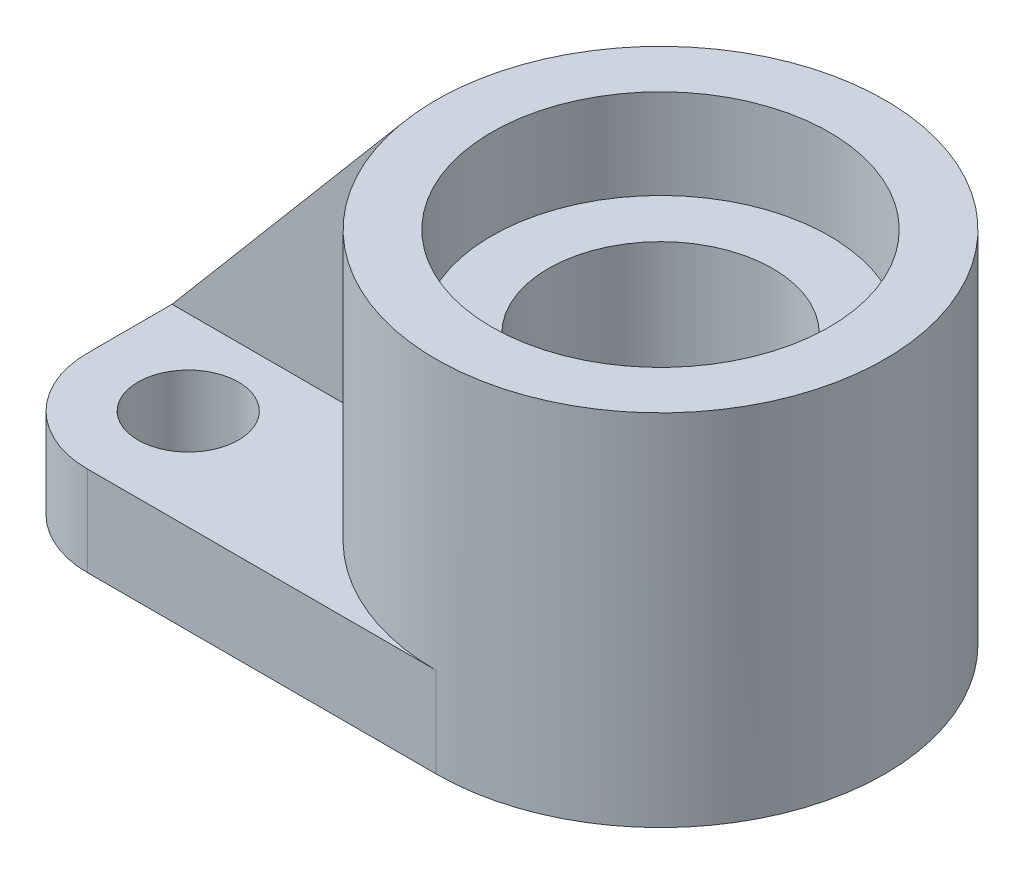
ISO-10303-21;
HEADER;
FILE_DESCRIPTION(('STEP AP214'),'2;1');
FILE_NAME('part.step','',(''),(''),'','','');
FILE_SCHEMA(('AUTOMOTIVE_DESIGN { 1 0 10303 214 1 1 1 1 }'));
ENDSEC;
DATA;
#1=APPLICATION_CONTEXT('core data for automotive mechanical design processes');
#2=APPLICATION_PROTOCOL_DEFINITION('international standard','automotive_design',2000,#1);
#3=PRODUCT_CONTEXT('',#1,'mechanical');
#4=PRODUCT('Part','Part','',(#3));
#5=PRODUCT_RELATED_PRODUCT_CATEGORY('part','',(#4));
#6=PRODUCT_DEFINITION_FORMATION('','',#4);
#7=PRODUCT_DEFINITION_CONTEXT('part definition',#1,'design');
#8=PRODUCT_DEFINITION('design','',#6,#7);
#9=PRODUCT_DEFINITION_SHAPE('','',#8);
#10=(LENGTH_UNIT() NAMED_UNIT(*) SI_UNIT(.MILLI.,.METRE.));
#11=(NAMED_UNIT(*) PLANE_ANGLE_UNIT() SI_UNIT($,.RADIAN.));
#12=(NAMED_UNIT(*) SI_UNIT($,.STERADIAN.) SOLID_ANGLE_UNIT());
#13=UNCERTAINTY_MEASURE_WITH_UNIT(LENGTH_MEASURE(1.E-05),#10,'distance_accuracy_value','');
#14=(GEOMETRIC_REPRESENTATION_CONTEXT(3) GLOBAL_UNCERTAINTY_ASSIGNED_CONTEXT((#13)) GLOBAL_UNIT_ASSIGNED_CONTEXT((#10,
#11,#12)) REPRESENTATION_CONTEXT('',''));
#15=CARTESIAN_POINT('',(0.,0.,0.));
#16=DIRECTION('',(0.,0.,1.));
#17=DIRECTION('',(1.,0.,0.));
#18=AXIS2_PLACEMENT_3D('',#15,#16,#17);
#19=CARTESIAN_POINT('',(0.,50.,0.));
#20=DIRECTION('',(0.,1.,0.));
#21=DIRECTION('',(0.,0.,1.));
#22=AXIS2_PLACEMENT_3D('',#19,#20,#21);
#23=PLANE('',#22);
#24=CARTESIAN_POINT('',(-68.9999999999999,50.,-69.));
#25=DIRECTION('',(0.,1.,0.));
#26=DIRECTION('',(0.,0.,1.));
#27=AXIS2_PLACEMENT_3D('',#24,#25,#26);
#28=CIRCLE('',#27,28.);
#29=CARTESIAN_POINT('',(-68.9999999999999,50.,-41.));
#30=VERTEX_POINT('',#29);
#31=EDGE_CURVE('E200',#30,#30,#28,.T.);
#32=ORIENTED_EDGE('',*,*,#31,.F.);
#33=EDGE_LOOP('',(#32));
#34=FACE_BOUND('',#33,.T.);
#35=DIRECTION('',(0.,0.,-1.));
#36=VECTOR('',#35,1.);
#37=CARTESIAN_POINT('',(-125.,50.,0.));
#38=LINE('',#37,#36);
#39=CARTESIAN_POINT('',(-125.,50.,-22.));
#40=VERTEX_POINT('',#39);
#41=CARTESIAN_POINT('',(-125.,50.,-68.9999999999996));
#42=VERTEX_POINT('',#41);
#43=EDGE_CURVE('E78',#40,#42,#38,.T.);
#44=ORIENTED_EDGE('',*,*,#43,.F.);
#45=DIRECTION('',(-1.,0.,0.));
#46=VECTOR('',#45,1.);
#47=CARTESIAN_POINT('',(-125.,50.,-22.));
#48=LINE('',#47,#46);
#49=CARTESIAN_POINT('',(1.95122918127144,50.,-22.));
#50=VERTEX_POINT('',#49);
#51=EDGE_CURVE('E148',#50,#40,#48,.T.);
#52=ORIENTED_EDGE('',*,*,#51,.F.);
#53=CARTESIAN_POINT('',(125.,50.,0.));
#54=DIRECTION('',(0.,1.,0.));
#55=DIRECTION('',(0.,0.,1.));
#56=AXIS2_PLACEMENT_3D('',#53,#54,#55);
#57=CIRCLE('',#56,125.);
#58=CARTESIAN_POINT('',(125.,50.,-125.));
#59=VERTEX_POINT('',#58);
#60=EDGE_CURVE('E135',#59,#50,#57,.T.);
#61=ORIENTED_EDGE('',*,*,#60,.F.);
#62=DIRECTION('',(1.,0.,0.));
#63=VECTOR('',#62,1.);
#64=CARTESIAN_POINT('',(0.,50.,-125.));
#65=LINE('',#64,#63);
#66=CARTESIAN_POINT('',(-68.9999999999995,50.,-125.));
#67=VERTEX_POINT('',#66);
#68=EDGE_CURVE('E205',#67,#59,#65,.T.);
#69=ORIENTED_EDGE('',*,*,#68,.F.);
#70=CARTESIAN_POINT('',(-68.9999999999999,50.,-69.));
#71=DIRECTION('',(0.,1.,0.));
#72=DIRECTION('',(0.,0.,1.));
#73=AXIS2_PLACEMENT_3D('',#70,#71,#72);
#74=CIRCLE('',#73,56.);
#75=EDGE_CURVE('E208',#67,#42,#74,.T.);
#76=ORIENTED_EDGE('',*,*,#75,.T.);
#77=EDGE_LOOP('',(#44,#52,#61,#69,#76));
#78=FACE_BOUND('',#77,.T.);
#79=ADVANCED_FACE('F60',(#34,#78),#23,.T.);
#80=CARTESIAN_POINT('',(-68.9999999999999,50.,69.0000000000001));
#81=DIRECTION('',(0.,1.,0.));
#82=DIRECTION('',(0.,0.,1.));
#83=AXIS2_PLACEMENT_3D('',#80,#81,#82);
#84=CIRCLE('',#83,28.);
#85=CARTESIAN_POINT('',(-68.9999999999999,50.,97.0000000000001));
#86=VERTEX_POINT('',#85);
#87=EDGE_CURVE('E196',#86,#86,#84,.T.);
#88=ORIENTED_EDGE('',*,*,#87,.F.);
#89=EDGE_LOOP('',(#88));
#90=FACE_BOUND('',#89,.T.);
#91=CARTESIAN_POINT('',(1.95122918127141,50.,22.));
#92=VERTEX_POINT('',#91);
#93=CARTESIAN_POINT('',(125.,50.,125.));
#94=VERTEX_POINT('',#93);
#95=EDGE_CURVE('E145',#92,#94,#57,.T.);
#96=ORIENTED_EDGE('',*,*,#95,.F.);
#97=DIRECTION('',(1.,0.,0.));
#98=VECTOR('',#97,1.);
#99=CARTESIAN_POINT('',(-125.,50.,22.));
#100=LINE('',#99,#98);
#101=CARTESIAN_POINT('',(-125.,50.,22.));
#102=VERTEX_POINT('',#101);
#103=EDGE_CURVE('E86',#102,#92,#100,.T.);
#104=ORIENTED_EDGE('',*,*,#103,.F.);
#105=CARTESIAN_POINT('',(-125.,50.,68.9999999999997));
#106=VERTEX_POINT('',#105);
#107=EDGE_CURVE('E219',#106,#102,#38,.T.);
#108=ORIENTED_EDGE('',*,*,#107,.F.);
#109=CARTESIAN_POINT('',(-68.9999999999999,50.,69.0000000000001));
#110=DIRECTION('',(0.,1.,0.));
#111=DIRECTION('',(0.,0.,1.));
#112=AXIS2_PLACEMENT_3D('',#109,#110,#111);
#113=CIRCLE('',#112,56.);
#114=CARTESIAN_POINT('',(-68.9999999999995,50.,125.));
#115=VERTEX_POINT('',#114);
#116=EDGE_CURVE('E213',#115,#106,#113,.F.);
#117=ORIENTED_EDGE('',*,*,#116,.F.);
#118=DIRECTION('',(1.,0.,0.));
#119=VECTOR('',#118,1.);
#120=CARTESIAN_POINT('',(0.,50.,125.));
#121=LINE('',#120,#119);
#122=EDGE_CURVE('E224',#115,#94,#121,.T.);
#123=ORIENTED_EDGE('',*,*,#122,.T.);
#124=EDGE_LOOP('',(#96,#104,#108,#117,#123));
#125=FACE_BOUND('',#124,.T.);
#126=ADVANCED_FACE('F293',(#90,#125),#23,.T.);
#127=CARTESIAN_POINT('',(125.,200.,0.));
#128=DIRECTION('',(0.,-1.,0.));
#129=DIRECTION('',(0.,0.,-1.));
#130=AXIS2_PLACEMENT_3D('',#127,#128,#129);
#131=CYLINDRICAL_SURFACE('',#130,125.);
#132=DIRECTION('',(0.,-1.,0.));
#133=VECTOR('',#132,1.);
#134=CARTESIAN_POINT('',(1.95122918127144,200.,22.));
#135=LINE('',#134,#133);
#136=CARTESIAN_POINT('',(1.9511408744372,200.,22.0000000257564));
#137=VERTEX_POINT('',#136);
#138=EDGE_CURVE('E157',#92,#137,#135,.F.);
#139=ORIENTED_EDGE('',*,*,#138,.F.);
#140=ORIENTED_EDGE('',*,*,#95,.T.);
#141=DIRECTION('',(0.,-1.,0.));
#142=VECTOR('',#141,1.);
#143=CARTESIAN_POINT('',(125.,50.,125.));
#144=LINE('',#143,#142);
#145=CARTESIAN_POINT('',(125.,0.,125.));
#146=VERTEX_POINT('',#145);
#147=EDGE_CURVE('E259',#94,#146,#144,.T.);
#148=ORIENTED_EDGE('',*,*,#147,.T.);
#149=CARTESIAN_POINT('',(125.,0.,0.));
#150=DIRECTION('',(0.,1.,0.));
#151=DIRECTION('',(0.,0.,1.));
#152=AXIS2_PLACEMENT_3D('',#149,#150,#151);
#153=CIRCLE('',#152,125.);
#154=CARTESIAN_POINT('',(125.,0.,-125.));
#155=VERTEX_POINT('',#154);
#156=EDGE_CURVE('E192',#146,#155,#153,.T.);
#157=ORIENTED_EDGE('',*,*,#156,.T.);
#158=DIRECTION('',(0.,-1.,0.));
#159=VECTOR('',#158,1.);
#160=CARTESIAN_POINT('',(125.,50.,-125.));
#161=LINE('',#160,#159);
#162=EDGE_CURVE('E141',#59,#155,#161,.T.);
#163=ORIENTED_EDGE('',*,*,#162,.F.);
#164=ORIENTED_EDGE('',*,*,#60,.T.);
#165=DIRECTION('',(0.,-1.,0.));
#166=VECTOR('',#165,1.);
#167=CARTESIAN_POINT('',(1.95122918127144,200.,-22.));
#168=LINE('',#167,#166);
#169=CARTESIAN_POINT('',(1.95113013931138,200.,-22.0000000251392));
#170=VERTEX_POINT('',#169);
#171=EDGE_CURVE('E138',#170,#50,#168,.T.);
#172=ORIENTED_EDGE('',*,*,#171,.F.);
#173=CARTESIAN_POINT('',(125.,200.,0.));
#174=DIRECTION('',(0.,-1.,0.));
#175=DIRECTION('',(0.,0.,-1.));
#176=AXIS2_PLACEMENT_3D('',#173,#174,#175);
#177=CIRCLE('',#176,125.);
#178=EDGE_CURVE('E195',#137,#170,#177,.F.);
#179=ORIENTED_EDGE('',*,*,#178,.F.);
#180=EDGE_LOOP('',(#139,#140,#148,#157,#163,#164,#172,#179));
#181=FACE_BOUND('',#180,.T.);
#182=ADVANCED_FACE('F136',(#181),#131,.T.);
#183=CARTESIAN_POINT('',(0.,50.,-125.));
#184=DIRECTION('',(0.,0.,-1.));
#185=DIRECTION('',(-1.,0.,0.));
#186=AXIS2_PLACEMENT_3D('',#183,#184,#185);
#187=PLANE('',#186);
#188=DIRECTION('',(1.,0.,0.));
#189=VECTOR('',#188,1.);
#190=CARTESIAN_POINT('',(0.,0.,-125.));
#191=LINE('',#190,#189);
#192=CARTESIAN_POINT('',(-68.9999999999995,0.,-125.));
#193=VERTEX_POINT('',#192);
#194=EDGE_CURVE('E238',#193,#155,#191,.T.);
#195=ORIENTED_EDGE('',*,*,#194,.F.);
#196=DIRECTION('',(0.,-1.,0.));
#197=VECTOR('',#196,1.);
#198=CARTESIAN_POINT('',(-68.9999999999995,50.,-125.));
#199=LINE('',#198,#197);
#200=EDGE_CURVE('E12',#67,#193,#199,.T.);
#201=ORIENTED_EDGE('',*,*,#200,.F.);
#202=ORIENTED_EDGE('',*,*,#68,.T.);
#203=ORIENTED_EDGE('',*,*,#162,.T.);
#204=EDGE_LOOP('',(#195,#201,#202,#203));
#205=FACE_BOUND('',#204,.T.);
#206=ADVANCED_FACE('F292',(#205),#187,.T.);
#207=CARTESIAN_POINT('',(-68.9999999999999,50.,-69.));
#208=DIRECTION('',(0.,-1.,0.));
#209=DIRECTION('',(0.,0.,-1.));
#210=AXIS2_PLACEMENT_3D('',#207,#208,#209);
#211=CYLINDRICAL_SURFACE('',#210,56.);
#212=CARTESIAN_POINT('',(-68.9999999999999,0.,-69.));
#213=DIRECTION('',(0.,1.,0.));
#214=DIRECTION('',(0.,0.,1.));
#215=AXIS2_PLACEMENT_3D('',#212,#213,#214);
#216=CIRCLE('',#215,56.);
#217=CARTESIAN_POINT('',(-125.,0.,-68.9999999999996));
#218=VERTEX_POINT('',#217);
#219=EDGE_CURVE('E242',#193,#218,#216,.T.);
#220=ORIENTED_EDGE('',*,*,#219,.T.);
#221=DIRECTION('',(0.,-1.,0.));
#222=VECTOR('',#221,1.);
#223=CARTESIAN_POINT('',(-125.,50.,-68.9999999999996));
#224=LINE('',#223,#222);
#225=EDGE_CURVE('E70',#42,#218,#224,.T.);
#226=ORIENTED_EDGE('',*,*,#225,.F.);
#227=ORIENTED_EDGE('',*,*,#75,.F.);
#228=ORIENTED_EDGE('',*,*,#200,.T.);
#229=EDGE_LOOP('',(#220,#226,#227,#228));
#230=FACE_BOUND('',#229,.T.);
#231=ADVANCED_FACE('F312',(#230),#211,.T.);
#232=CARTESIAN_POINT('',(-125.,50.,0.));
#233=DIRECTION('',(-1.,0.,0.));
#234=DIRECTION('',(0.,0.,1.));
#235=AXIS2_PLACEMENT_3D('',#232,#233,#234);
#236=PLANE('',#235);
#237=DIRECTION('',(0.,0.,-1.));
#238=VECTOR('',#237,1.);
#239=CARTESIAN_POINT('',(-125.,0.,0.));
#240=LINE('',#239,#238);
#241=CARTESIAN_POINT('',(-125.,0.,68.9999999999997));
#242=VERTEX_POINT('',#241);
#243=EDGE_CURVE('E246',#242,#218,#240,.T.);
#244=ORIENTED_EDGE('',*,*,#243,.F.);
#245=DIRECTION('',(0.,-1.,0.));
#246=VECTOR('',#245,1.);
#247=CARTESIAN_POINT('',(-125.,50.,68.9999999999997));
#248=LINE('',#247,#246);
#249=EDGE_CURVE('E266',#106,#242,#248,.T.);
#250=ORIENTED_EDGE('',*,*,#249,.F.);
#251=ORIENTED_EDGE('',*,*,#107,.T.);
#252=DIRECTION('',(0.,0.,1.));
#253=VECTOR('',#252,1.);
#254=CARTESIAN_POINT('',(-125.,50.,-22.));
#255=LINE('',#254,#253);
#256=EDGE_CURVE('E337',#40,#102,#255,.T.);
#257=ORIENTED_EDGE('',*,*,#256,.F.);
#258=ORIENTED_EDGE('',*,*,#43,.T.);
#259=ORIENTED_EDGE('',*,*,#225,.T.);
#260=EDGE_LOOP('',(#244,#250,#251,#257,#258,#259));
#261=FACE_BOUND('',#260,.T.);
#262=ADVANCED_FACE('F308',(#261),#236,.T.);
#263=CARTESIAN_POINT('',(-68.9999999999999,50.,69.0000000000001));
#264=DIRECTION('',(0.,-1.,0.));
#265=DIRECTION('',(0.,0.,-1.));
#266=AXIS2_PLACEMENT_3D('',#263,#264,#265);
#267=CYLINDRICAL_SURFACE('',#266,56.);
#268=CARTESIAN_POINT('',(-68.9999999999999,0.,69.0000000000001));
#269=DIRECTION('',(0.,1.,0.));
#270=DIRECTION('',(0.,0.,1.));
#271=AXIS2_PLACEMENT_3D('',#268,#269,#270);
#272=CIRCLE('',#271,56.);
#273=CARTESIAN_POINT('',(-68.9999999999995,0.,125.));
#274=VERTEX_POINT('',#273);
#275=EDGE_CURVE('E250',#274,#242,#272,.F.);
#276=ORIENTED_EDGE('',*,*,#275,.F.);
#277=DIRECTION('',(0.,-1.,0.));
#278=VECTOR('',#277,1.);
#279=CARTESIAN_POINT('',(-68.9999999999995,50.,125.));
#280=LINE('',#279,#278);
#281=EDGE_CURVE('E263',#115,#274,#280,.T.);
#282=ORIENTED_EDGE('',*,*,#281,.F.);
#283=ORIENTED_EDGE('',*,*,#116,.T.);
#284=ORIENTED_EDGE('',*,*,#249,.T.);
#285=EDGE_LOOP('',(#276,#282,#283,#284));
#286=FACE_BOUND('',#285,.T.);
#287=ADVANCED_FACE('F304',(#286),#267,.T.);
#288=CARTESIAN_POINT('',(0.,50.,125.));
#289=DIRECTION('',(0.,0.,-1.));
#290=DIRECTION('',(-1.,0.,0.));
#291=AXIS2_PLACEMENT_3D('',#288,#289,#290);
#292=PLANE('',#291);
#293=DIRECTION('',(1.,0.,0.));
#294=VECTOR('',#293,1.);
#295=CARTESIAN_POINT('',(0.,0.,125.));
#296=LINE('',#295,#294);
#297=EDGE_CURVE('E201',#274,#146,#296,.T.);
#298=ORIENTED_EDGE('',*,*,#297,.T.);
#299=ORIENTED_EDGE('',*,*,#147,.F.);
#300=ORIENTED_EDGE('',*,*,#122,.F.);
#301=ORIENTED_EDGE('',*,*,#281,.T.);
#302=EDGE_LOOP('',(#298,#299,#300,#301));
#303=FACE_BOUND('',#302,.T.);
#304=ADVANCED_FACE('F300',(#303),#292,.F.);
#305=CARTESIAN_POINT('',(-68.9999999999999,50.,-69.));
#306=DIRECTION('',(0.,-1.,0.));
#307=DIRECTION('',(0.,0.,-1.));
#308=AXIS2_PLACEMENT_3D('',#305,#306,#307);
#309=CYLINDRICAL_SURFACE('',#308,28.);
#310=ORIENTED_EDGE('',*,*,#31,.T.);
#311=EDGE_LOOP('',(#310));
#312=FACE_BOUND('',#311,.T.);
#313=CARTESIAN_POINT('',(-68.9999999999999,0.,-69.));
#314=DIRECTION('',(0.,1.,0.));
#315=DIRECTION('',(0.,0.,1.));
#316=AXIS2_PLACEMENT_3D('',#313,#314,#315);
#317=CIRCLE('',#316,28.);
#318=CARTESIAN_POINT('',(-68.9999999999999,0.,-41.));
#319=VERTEX_POINT('',#318);
#320=EDGE_CURVE('E233',#319,#319,#317,.T.);
#321=ORIENTED_EDGE('',*,*,#320,.F.);
#322=EDGE_LOOP('',(#321));
#323=FACE_BOUND('',#322,.T.);
#324=ADVANCED_FACE('F303',(#312,#323),#309,.F.);
#325=CARTESIAN_POINT('',(-68.9999999999999,50.,69.0000000000001));
#326=DIRECTION('',(0.,-1.,0.));
#327=DIRECTION('',(0.,0.,-1.));
#328=AXIS2_PLACEMENT_3D('',#325,#326,#327);
#329=CYLINDRICAL_SURFACE('',#328,28.);
#330=ORIENTED_EDGE('',*,*,#87,.T.);
#331=EDGE_LOOP('',(#330));
#332=FACE_BOUND('',#331,.T.);
#333=CARTESIAN_POINT('',(-68.9999999999999,0.,69.0000000000001));
#334=DIRECTION('',(0.,1.,0.));
#335=DIRECTION('',(0.,0.,1.));
#336=AXIS2_PLACEMENT_3D('',#333,#334,#335);
#337=CIRCLE('',#336,28.);
#338=CARTESIAN_POINT('',(-68.9999999999999,0.,97.0000000000001));
#339=VERTEX_POINT('',#338);
#340=EDGE_CURVE('E228',#339,#339,#337,.T.);
#341=ORIENTED_EDGE('',*,*,#340,.F.);
#342=EDGE_LOOP('',(#341));
#343=FACE_BOUND('',#342,.T.);
#344=ADVANCED_FACE('F62',(#332,#343),#329,.F.);
#345=CARTESIAN_POINT('',(0.,0.,0.));
#346=DIRECTION('',(0.,1.,0.));
#347=DIRECTION('',(0.,0.,1.));
#348=AXIS2_PLACEMENT_3D('',#345,#346,#347);
#349=PLANE('',#348);
#350=CARTESIAN_POINT('',(125.,0.,0.));
#351=DIRECTION('',(0.,1.,0.));
#352=DIRECTION('',(0.,0.,1.));
#353=AXIS2_PLACEMENT_3D('',#350,#351,#352);
#354=CIRCLE('',#353,62.4999999999999);
#355=CARTESIAN_POINT('',(125.,0.,62.4999999999999));
#356=VERTEX_POINT('',#355);
#357=EDGE_CURVE('E188',#356,#356,#354,.T.);
#358=ORIENTED_EDGE('',*,*,#357,.T.);
#359=EDGE_LOOP('',(#358));
#360=FACE_BOUND('',#359,.T.);
#361=ORIENTED_EDGE('',*,*,#340,.T.);
#362=EDGE_LOOP('',(#361));
#363=FACE_BOUND('',#362,.T.);
#364=ORIENTED_EDGE('',*,*,#320,.T.);
#365=EDGE_LOOP('',(#364));
#366=FACE_BOUND('',#365,.T.);
#367=ORIENTED_EDGE('',*,*,#194,.T.);
#368=ORIENTED_EDGE('',*,*,#156,.F.);
#369=ORIENTED_EDGE('',*,*,#297,.F.);
#370=ORIENTED_EDGE('',*,*,#275,.T.);
#371=ORIENTED_EDGE('',*,*,#243,.T.);
#372=ORIENTED_EDGE('',*,*,#219,.F.);
#373=EDGE_LOOP('',(#367,#368,#369,#370,#371,#372));
#374=FACE_BOUND('',#373,.T.);
#375=ADVANCED_FACE('F288',(#360,#363,#366,#374),#349,.F.);
#376=CARTESIAN_POINT('',(125.,200.,0.));
#377=DIRECTION('',(0.,1.,0.));
#378=DIRECTION('',(0.,0.,1.));
#379=AXIS2_PLACEMENT_3D('',#376,#377,#378);
#380=PLANE('',#379);
#381=ORIENTED_EDGE('',*,*,#178,.T.);
#382=CARTESIAN_POINT('',(1.95122918127132,200.,22.));
#383=CARTESIAN_POINT('',(0.660562514604653,200.,14.7811387786346));
#384=CARTESIAN_POINT('',(0.,200.,7.39101962602793));
#385=CARTESIAN_POINT('',(0.,200.,-7.39101962602797));
#386=CARTESIAN_POINT('',(0.660562514604664,200.,-14.7811387786346));
#387=CARTESIAN_POINT('',(1.95122918127133,200.,-22.));
#388=B_SPLINE_CURVE_WITH_KNOTS('',3,(#382,#383,#384,#385,#386,#387),.UNSPECIFIED.,.F.,.F.,(4,2,
4),(0.,0.5,1.),.UNSPECIFIED.);
#389=EDGE_CURVE('E234',#170,#137,#388,.F.);
#390=ORIENTED_EDGE('',*,*,#389,.T.);
#391=EDGE_LOOP('',(#381,#390));
#392=FACE_BOUND('',#391,.T.);
#393=CARTESIAN_POINT('',(125.,200.,0.));
#394=DIRECTION('',(0.,1.,0.));
#395=DIRECTION('',(0.,0.,1.));
#396=AXIS2_PLACEMENT_3D('',#393,#394,#395);
#397=CIRCLE('',#396,94.);
#398=CARTESIAN_POINT('',(125.,200.,94.));
#399=VERTEX_POINT('',#398);
#400=EDGE_CURVE('E163',#399,#399,#397,.T.);
#401=ORIENTED_EDGE('',*,*,#400,.F.);
#402=EDGE_LOOP('',(#401));
#403=FACE_BOUND('',#402,.T.);
#404=ADVANCED_FACE('F277',(#392,#403),#380,.T.);
#405=CARTESIAN_POINT('',(125.,200.,0.));
#406=DIRECTION('',(0.,1.,0.));
#407=DIRECTION('',(0.,0.,1.));
#408=AXIS2_PLACEMENT_3D('',#405,#406,#407);
#409=CYLINDRICAL_SURFACE('',#408,62.5);
#410=ORIENTED_EDGE('',*,*,#357,.F.);
#411=EDGE_LOOP('',(#410));
#412=FACE_BOUND('',#411,.T.);
#413=CARTESIAN_POINT('',(125.,150.,0.));
#414=DIRECTION('',(0.,1.,0.));
#415=DIRECTION('',(0.,0.,1.));
#416=AXIS2_PLACEMENT_3D('',#413,#414,#415);
#417=CIRCLE('',#416,62.5);
#418=CARTESIAN_POINT('',(125.,150.,62.5));
#419=VERTEX_POINT('',#418);
#420=EDGE_CURVE('E184',#419,#419,#417,.T.);
#421=ORIENTED_EDGE('',*,*,#420,.T.);
#422=EDGE_LOOP('',(#421));
#423=FACE_BOUND('',#422,.T.);
#424=ADVANCED_FACE('F287',(#412,#423),#409,.F.);
#425=CARTESIAN_POINT('',(187.5,150.,0.));
#426=DIRECTION('',(0.,-1.,0.));
#427=DIRECTION('',(0.,0.,-1.));
#428=AXIS2_PLACEMENT_3D('',#425,#426,#427);
#429=PLANE('',#428);
#430=ORIENTED_EDGE('',*,*,#420,.F.);
#431=EDGE_LOOP('',(#430));
#432=FACE_BOUND('',#431,.T.);
#433=CARTESIAN_POINT('',(125.,150.,0.));
#434=DIRECTION('',(0.,1.,0.));
#435=DIRECTION('',(0.,0.,1.));
#436=AXIS2_PLACEMENT_3D('',#433,#434,#435);
#437=CIRCLE('',#436,94.);
#438=CARTESIAN_POINT('',(125.,150.,94.));
#439=VERTEX_POINT('',#438);
#440=EDGE_CURVE('E180',#439,#439,#437,.T.);
#441=ORIENTED_EDGE('',*,*,#440,.T.);
#442=EDGE_LOOP('',(#441));
#443=FACE_BOUND('',#442,.T.);
#444=ADVANCED_FACE('F379',(#432,#443),#429,.F.);
#445=CARTESIAN_POINT('',(125.,200.,0.));
#446=DIRECTION('',(0.,1.,0.));
#447=DIRECTION('',(0.,0.,1.));
#448=AXIS2_PLACEMENT_3D('',#445,#446,#447);
#449=CYLINDRICAL_SURFACE('',#448,94.);
#450=ORIENTED_EDGE('',*,*,#440,.F.);
#451=EDGE_LOOP('',(#450));
#452=FACE_BOUND('',#451,.T.);
#453=ORIENTED_EDGE('',*,*,#400,.T.);
#454=EDGE_LOOP('',(#453));
#455=FACE_BOUND('',#454,.T.);
#456=ADVANCED_FACE('F372',(#452,#455),#449,.F.);
#457=CARTESIAN_POINT('',(0.,0.,22.));
#458=DIRECTION('',(0.,0.,-1.));
#459=DIRECTION('',(-1.,0.,0.));
#460=AXIS2_PLACEMENT_3D('',#457,#458,#459);
#461=PLANE('',#460);
#462=ORIENTED_EDGE('',*,*,#103,.T.);
#463=ORIENTED_EDGE('',*,*,#138,.T.);
#464=DIRECTION('',(0.646025723832344,0.763315638610199,0.));
#465=VECTOR('',#464,1.);
#466=CARTESIAN_POINT('',(-61.5243854093643,125.,22.));
#467=LINE('',#466,#465);
#468=EDGE_CURVE('E158',#102,#137,#467,.T.);
#469=ORIENTED_EDGE('',*,*,#468,.F.);
#470=EDGE_LOOP('',(#462,#463,#469));
#471=FACE_BOUND('',#470,.T.);
#472=ADVANCED_FACE('F354',(#471),#461,.F.);
#473=CARTESIAN_POINT('',(0.,0.,-22.));
#474=DIRECTION('',(0.,0.,1.));
#475=DIRECTION('',(0.,-1.,0.));
#476=AXIS2_PLACEMENT_3D('',#473,#474,#475);
#477=PLANE('',#476);
#478=DIRECTION('',(0.646025723832345,0.763315638610199,0.));
#479=VECTOR('',#478,1.);
#480=CARTESIAN_POINT('',(-125.,50.,-22.));
#481=LINE('',#480,#479);
#482=EDGE_CURVE('E153',#40,#170,#481,.T.);
#483=ORIENTED_EDGE('',*,*,#482,.T.);
#484=ORIENTED_EDGE('',*,*,#171,.T.);
#485=ORIENTED_EDGE('',*,*,#51,.T.);
#486=EDGE_LOOP('',(#483,#484,#485));
#487=FACE_BOUND('',#486,.T.);
#488=ADVANCED_FACE('F155',(#487),#477,.F.);
#489=CARTESIAN_POINT('',(-125.,50.,-22.));
#490=CARTESIAN_POINT('',(1.95122918127133,200.,-22.));
#491=CARTESIAN_POINT('',(-125.,50.,-14.6666666666667));
#492=CARTESIAN_POINT('',(0.660562514604664,200.,-14.7811387786346));
#493=CARTESIAN_POINT('',(-125.,50.,-7.33333333333334));
#494=CARTESIAN_POINT('',(0.,200.,-7.39101962602797));
#495=CARTESIAN_POINT('',(-125.,50.,7.33333333333332));
#496=CARTESIAN_POINT('',(0.,200.,7.39101962602793));
#497=CARTESIAN_POINT('',(-125.,50.,14.6666666666667));
#498=CARTESIAN_POINT('',(0.660562514604653,200.,14.7811387786346));
#499=CARTESIAN_POINT('',(-125.,50.,22.));
#500=CARTESIAN_POINT('',(1.95122918127132,200.,22.));
#501=B_SPLINE_SURFACE_WITH_KNOTS('',3,1,((#489,#490),(#491,#492),(#493,#494),(#495,#496),(#497,
#498),(#499,#500)),.UNSPECIFIED.,.F.,.F.,.F.,(4,2,4),(2,2),(0.,0.5,1.),(0.,1.),.UNSPECIFIED.);
#502=ORIENTED_EDGE('',*,*,#256,.T.);
#503=ORIENTED_EDGE('',*,*,#468,.T.);
#504=ORIENTED_EDGE('',*,*,#389,.F.);
#505=ORIENTED_EDGE('',*,*,#482,.F.);
#506=EDGE_LOOP('',(#502,#503,#504,#505));
#507=FACE_BOUND('',#506,.T.);
#508=ADVANCED_FACE('F355',(#507),#501,.T.);
#509=CLOSED_SHELL('',(#79,#126,#182,#206,#231,#262,#287,#304,#324,#344,#375,#404,#424,#444,#456,
#472,#488,#508));
#510=MANIFOLD_SOLID_BREP('B2',#509);
#511=ADVANCED_BREP_SHAPE_REPRESENTATION('',(#18,#510),#14);
#512=SHAPE_DEFINITION_REPRESENTATION(#9,#511);
ENDSEC;
END-ISO-10303-21;
